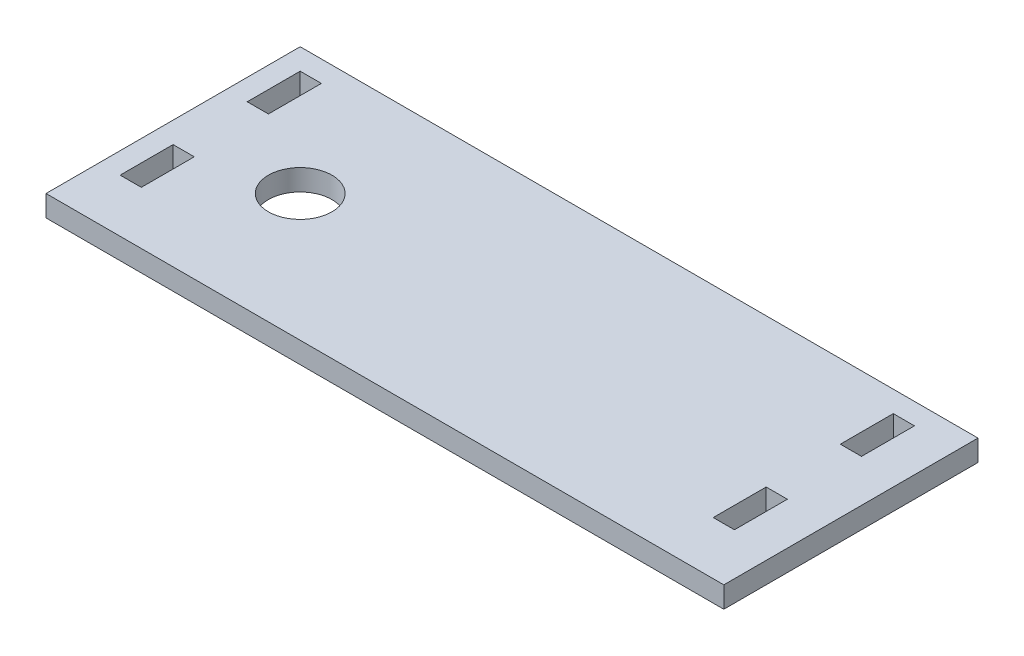
ISO-10303-21;
HEADER;
FILE_DESCRIPTION(('STEP AP214'),'2;1');
FILE_NAME('part.step','',(''),(''),'','','');
FILE_SCHEMA(('AUTOMOTIVE_DESIGN { 1 0 10303 214 1 1 1 1 }'));
ENDSEC;
DATA;
#1=APPLICATION_CONTEXT('core data for automotive mechanical design processes');
#2=APPLICATION_PROTOCOL_DEFINITION('international standard','automotive_design',2000,#1);
#3=PRODUCT_CONTEXT('',#1,'mechanical');
#4=PRODUCT('Part','Part','',(#3));
#5=PRODUCT_RELATED_PRODUCT_CATEGORY('part','',(#4));
#6=PRODUCT_DEFINITION_FORMATION('','',#4);
#7=PRODUCT_DEFINITION_CONTEXT('part definition',#1,'design');
#8=PRODUCT_DEFINITION('design','',#6,#7);
#9=PRODUCT_DEFINITION_SHAPE('','',#8);
#10=(LENGTH_UNIT() NAMED_UNIT(*) SI_UNIT(.MILLI.,.METRE.));
#11=(NAMED_UNIT(*) PLANE_ANGLE_UNIT() SI_UNIT($,.RADIAN.));
#12=(NAMED_UNIT(*) SI_UNIT($,.STERADIAN.) SOLID_ANGLE_UNIT());
#13=UNCERTAINTY_MEASURE_WITH_UNIT(LENGTH_MEASURE(1.E-05),#10,'distance_accuracy_value','');
#14=(GEOMETRIC_REPRESENTATION_CONTEXT(3) GLOBAL_UNCERTAINTY_ASSIGNED_CONTEXT((#13)) GLOBAL_UNIT_ASSIGNED_CONTEXT((#10,
#11,#12)) REPRESENTATION_CONTEXT('',''));
#15=CARTESIAN_POINT('',(0.,0.,0.));
#16=DIRECTION('',(0.,0.,1.));
#17=DIRECTION('',(1.,0.,0.));
#18=AXIS2_PLACEMENT_3D('',#15,#16,#17);
#19=CARTESIAN_POINT('',(0.,6.35,0.));
#20=DIRECTION('',(0.,1.,0.));
#21=DIRECTION('',(0.,0.,1.));
#22=AXIS2_PLACEMENT_3D('',#19,#20,#21);
#23=PLANE('',#22);
#24=DIRECTION('',(0.,0.,1.));
#25=VECTOR('',#24,1.);
#26=CARTESIAN_POINT('',(-101.6,6.35,-38.1));
#27=LINE('',#26,#25);
#28=CARTESIAN_POINT('',(-101.6,6.35,-38.1));
#29=VERTEX_POINT('',#28);
#30=CARTESIAN_POINT('',(-101.6,6.35,38.1));
#31=VERTEX_POINT('',#30);
#32=EDGE_CURVE('E370',#29,#31,#27,.T.);
#33=ORIENTED_EDGE('',*,*,#32,.T.);
#34=DIRECTION('',(1.,0.,0.));
#35=VECTOR('',#34,1.);
#36=CARTESIAN_POINT('',(-101.6,6.35,38.1));
#37=LINE('',#36,#35);
#38=CARTESIAN_POINT('',(101.6,6.35,38.1));
#39=VERTEX_POINT('',#38);
#40=EDGE_CURVE('E374',#31,#39,#37,.T.);
#41=ORIENTED_EDGE('',*,*,#40,.T.);
#42=DIRECTION('',(0.,0.,-1.));
#43=VECTOR('',#42,1.);
#44=CARTESIAN_POINT('',(101.6,6.35,-38.1));
#45=LINE('',#44,#43);
#46=CARTESIAN_POINT('',(101.6,6.35,-38.1));
#47=VERTEX_POINT('',#46);
#48=EDGE_CURVE('E378',#39,#47,#45,.T.);
#49=ORIENTED_EDGE('',*,*,#48,.T.);
#50=DIRECTION('',(-1.,0.,0.));
#51=VECTOR('',#50,1.);
#52=CARTESIAN_POINT('',(-101.6,6.35,-38.1));
#53=LINE('',#52,#51);
#54=EDGE_CURVE('E381',#47,#29,#53,.T.);
#55=ORIENTED_EDGE('',*,*,#54,.T.);
#56=EDGE_LOOP('',(#33,#41,#49,#55));
#57=FACE_BOUND('',#56,.T.);
#58=CARTESIAN_POINT('',(-63.5,6.35,0.));
#59=DIRECTION('',(0.,1.,0.));
#60=DIRECTION('',(0.,0.,1.));
#61=AXIS2_PLACEMENT_3D('',#58,#59,#60);
#62=CIRCLE('',#61,9.525);
#63=CARTESIAN_POINT('',(-63.5,6.35,9.525));
#64=VERTEX_POINT('',#63);
#65=EDGE_CURVE('E362',#64,#64,#62,.T.);
#66=ORIENTED_EDGE('',*,*,#65,.F.);
#67=EDGE_LOOP('',(#66));
#68=FACE_BOUND('',#67,.T.);
#69=DIRECTION('',(1.,0.,0.));
#70=VECTOR('',#69,1.);
#71=CARTESIAN_POINT('',(-95.25,6.35,-15.875));
#72=LINE('',#71,#70);
#73=CARTESIAN_POINT('',(-95.25,6.35,-15.875));
#74=VERTEX_POINT('',#73);
#75=CARTESIAN_POINT('',(-88.9,6.35,-15.875));
#76=VERTEX_POINT('',#75);
#77=EDGE_CURVE('E322',#74,#76,#72,.T.);
#78=ORIENTED_EDGE('',*,*,#77,.F.);
#79=DIRECTION('',(0.,0.,1.));
#80=VECTOR('',#79,1.);
#81=CARTESIAN_POINT('',(-95.25,6.35,-31.75));
#82=LINE('',#81,#80);
#83=CARTESIAN_POINT('',(-95.25,6.35,-31.75));
#84=VERTEX_POINT('',#83);
#85=EDGE_CURVE('E319',#84,#74,#82,.T.);
#86=ORIENTED_EDGE('',*,*,#85,.F.);
#87=DIRECTION('',(-1.,0.,0.));
#88=VECTOR('',#87,1.);
#89=CARTESIAN_POINT('',(-95.25,6.35,-31.75));
#90=LINE('',#89,#88);
#91=CARTESIAN_POINT('',(-88.9,6.35,-31.75));
#92=VERTEX_POINT('',#91);
#93=EDGE_CURVE('E330',#92,#84,#90,.T.);
#94=ORIENTED_EDGE('',*,*,#93,.F.);
#95=DIRECTION('',(0.,0.,-1.));
#96=VECTOR('',#95,1.);
#97=CARTESIAN_POINT('',(-88.9,6.35,-31.75));
#98=LINE('',#97,#96);
#99=EDGE_CURVE('E326',#76,#92,#98,.T.);
#100=ORIENTED_EDGE('',*,*,#99,.F.);
#101=EDGE_LOOP('',(#78,#86,#94,#100));
#102=FACE_BOUND('',#101,.T.);
#103=DIRECTION('',(1.,0.,0.));
#104=VECTOR('',#103,1.);
#105=CARTESIAN_POINT('',(82.55,6.35,22.225));
#106=LINE('',#105,#104);
#107=CARTESIAN_POINT('',(82.55,6.35,22.225));
#108=VERTEX_POINT('',#107);
#109=CARTESIAN_POINT('',(88.9,6.35,22.225));
#110=VERTEX_POINT('',#109);
#111=EDGE_CURVE('E279',#108,#110,#106,.T.);
#112=ORIENTED_EDGE('',*,*,#111,.F.);
#113=DIRECTION('',(0.,0.,1.));
#114=VECTOR('',#113,1.);
#115=CARTESIAN_POINT('',(82.55,6.35,6.35));
#116=LINE('',#115,#114);
#117=CARTESIAN_POINT('',(82.55,6.35,6.35));
#118=VERTEX_POINT('',#117);
#119=EDGE_CURVE('E276',#118,#108,#116,.T.);
#120=ORIENTED_EDGE('',*,*,#119,.F.);
#121=DIRECTION('',(-1.,0.,0.));
#122=VECTOR('',#121,1.);
#123=CARTESIAN_POINT('',(82.55,6.35,6.35));
#124=LINE('',#123,#122);
#125=CARTESIAN_POINT('',(88.9,6.35,6.35));
#126=VERTEX_POINT('',#125);
#127=EDGE_CURVE('E287',#126,#118,#124,.T.);
#128=ORIENTED_EDGE('',*,*,#127,.F.);
#129=DIRECTION('',(0.,0.,-1.));
#130=VECTOR('',#129,1.);
#131=CARTESIAN_POINT('',(88.9,6.35,6.35));
#132=LINE('',#131,#130);
#133=EDGE_CURVE('E283',#110,#126,#132,.T.);
#134=ORIENTED_EDGE('',*,*,#133,.F.);
#135=EDGE_LOOP('',(#112,#120,#128,#134));
#136=FACE_BOUND('',#135,.T.);
#137=DIRECTION('',(1.,0.,0.));
#138=VECTOR('',#137,1.);
#139=CARTESIAN_POINT('',(-95.25,6.35,22.225));
#140=LINE('',#139,#138);
#141=CARTESIAN_POINT('',(-95.25,6.35,22.225));
#142=VERTEX_POINT('',#141);
#143=CARTESIAN_POINT('',(-88.9,6.35,22.225));
#144=VERTEX_POINT('',#143);
#145=EDGE_CURVE('E236',#142,#144,#140,.T.);
#146=ORIENTED_EDGE('',*,*,#145,.F.);
#147=DIRECTION('',(0.,0.,1.));
#148=VECTOR('',#147,1.);
#149=CARTESIAN_POINT('',(-95.25,6.35,6.35));
#150=LINE('',#149,#148);
#151=CARTESIAN_POINT('',(-95.25,6.35,6.35));
#152=VERTEX_POINT('',#151);
#153=EDGE_CURVE('E233',#152,#142,#150,.T.);
#154=ORIENTED_EDGE('',*,*,#153,.F.);
#155=DIRECTION('',(-1.,0.,0.));
#156=VECTOR('',#155,1.);
#157=CARTESIAN_POINT('',(-95.25,6.35,6.35));
#158=LINE('',#157,#156);
#159=CARTESIAN_POINT('',(-88.9,6.35,6.35));
#160=VERTEX_POINT('',#159);
#161=EDGE_CURVE('E244',#160,#152,#158,.T.);
#162=ORIENTED_EDGE('',*,*,#161,.F.);
#163=DIRECTION('',(0.,0.,-1.));
#164=VECTOR('',#163,1.);
#165=CARTESIAN_POINT('',(-88.9,6.35,6.35));
#166=LINE('',#165,#164);
#167=EDGE_CURVE('E240',#144,#160,#166,.T.);
#168=ORIENTED_EDGE('',*,*,#167,.F.);
#169=EDGE_LOOP('',(#146,#154,#162,#168));
#170=FACE_BOUND('',#169,.T.);
#171=DIRECTION('',(1.,0.,0.));
#172=VECTOR('',#171,1.);
#173=CARTESIAN_POINT('',(82.55,6.35,-15.875));
#174=LINE('',#173,#172);
#175=CARTESIAN_POINT('',(82.55,6.35,-15.875));
#176=VERTEX_POINT('',#175);
#177=CARTESIAN_POINT('',(88.9,6.35,-15.875));
#178=VERTEX_POINT('',#177);
#179=EDGE_CURVE('E194',#176,#178,#174,.T.);
#180=ORIENTED_EDGE('',*,*,#179,.F.);
#181=DIRECTION('',(0.,0.,1.));
#182=VECTOR('',#181,1.);
#183=CARTESIAN_POINT('',(82.55,6.35,-31.75));
#184=LINE('',#183,#182);
#185=CARTESIAN_POINT('',(82.55,6.35,-31.75));
#186=VERTEX_POINT('',#185);
#187=EDGE_CURVE('E185',#186,#176,#184,.T.);
#188=ORIENTED_EDGE('',*,*,#187,.F.);
#189=DIRECTION('',(-1.,0.,0.));
#190=VECTOR('',#189,1.);
#191=CARTESIAN_POINT('',(82.55,6.35,-31.75));
#192=LINE('',#191,#190);
#193=CARTESIAN_POINT('',(88.9,6.35,-31.75));
#194=VERTEX_POINT('',#193);
#195=EDGE_CURVE('E211',#194,#186,#192,.T.);
#196=ORIENTED_EDGE('',*,*,#195,.F.);
#197=DIRECTION('',(0.,0.,-1.));
#198=VECTOR('',#197,1.);
#199=CARTESIAN_POINT('',(88.9,6.35,-31.75));
#200=LINE('',#199,#198);
#201=EDGE_CURVE('E207',#178,#194,#200,.T.);
#202=ORIENTED_EDGE('',*,*,#201,.F.);
#203=EDGE_LOOP('',(#180,#188,#196,#202));
#204=FACE_BOUND('',#203,.T.);
#205=ADVANCED_FACE('F47',(#57,#68,#102,#136,#170,#204),#23,.T.);
#206=CARTESIAN_POINT('',(0.,0.,0.));
#207=DIRECTION('',(0.,1.,0.));
#208=DIRECTION('',(0.,0.,1.));
#209=AXIS2_PLACEMENT_3D('',#206,#207,#208);
#210=PLANE('',#209);
#211=DIRECTION('',(0.,0.,1.));
#212=VECTOR('',#211,1.);
#213=CARTESIAN_POINT('',(-95.25,0.,6.35));
#214=LINE('',#213,#212);
#215=CARTESIAN_POINT('',(-95.25,0.,6.35));
#216=VERTEX_POINT('',#215);
#217=CARTESIAN_POINT('',(-95.25,0.,22.225));
#218=VERTEX_POINT('',#217);
#219=EDGE_CURVE('E203',#216,#218,#214,.T.);
#220=ORIENTED_EDGE('',*,*,#219,.T.);
#221=DIRECTION('',(1.,0.,0.));
#222=VECTOR('',#221,1.);
#223=CARTESIAN_POINT('',(-95.25,0.,22.225));
#224=LINE('',#223,#222);
#225=CARTESIAN_POINT('',(-88.9,0.,22.225));
#226=VERTEX_POINT('',#225);
#227=EDGE_CURVE('E251',#218,#226,#224,.T.);
#228=ORIENTED_EDGE('',*,*,#227,.T.);
#229=DIRECTION('',(0.,0.,-1.));
#230=VECTOR('',#229,1.);
#231=CARTESIAN_POINT('',(-88.9,0.,6.35));
#232=LINE('',#231,#230);
#233=CARTESIAN_POINT('',(-88.9,0.,6.35));
#234=VERTEX_POINT('',#233);
#235=EDGE_CURVE('E255',#226,#234,#232,.T.);
#236=ORIENTED_EDGE('',*,*,#235,.T.);
#237=DIRECTION('',(-1.,0.,0.));
#238=VECTOR('',#237,1.);
#239=CARTESIAN_POINT('',(-95.25,0.,6.35));
#240=LINE('',#239,#238);
#241=EDGE_CURVE('E237',#234,#216,#240,.T.);
#242=ORIENTED_EDGE('',*,*,#241,.T.);
#243=EDGE_LOOP('',(#220,#228,#236,#242));
#244=FACE_BOUND('',#243,.T.);
#245=DIRECTION('',(0.,0.,1.));
#246=VECTOR('',#245,1.);
#247=CARTESIAN_POINT('',(-95.25,0.,-31.75));
#248=LINE('',#247,#246);
#249=CARTESIAN_POINT('',(-95.25,0.,-31.75));
#250=VERTEX_POINT('',#249);
#251=CARTESIAN_POINT('',(-95.25,0.,-15.875));
#252=VERTEX_POINT('',#251);
#253=EDGE_CURVE('E318',#250,#252,#248,.T.);
#254=ORIENTED_EDGE('',*,*,#253,.T.);
#255=DIRECTION('',(1.,0.,0.));
#256=VECTOR('',#255,1.);
#257=CARTESIAN_POINT('',(-95.25,0.,-15.875));
#258=LINE('',#257,#256);
#259=CARTESIAN_POINT('',(-88.9,0.,-15.875));
#260=VERTEX_POINT('',#259);
#261=EDGE_CURVE('E337',#252,#260,#258,.T.);
#262=ORIENTED_EDGE('',*,*,#261,.T.);
#263=DIRECTION('',(0.,0.,-1.));
#264=VECTOR('',#263,1.);
#265=CARTESIAN_POINT('',(-88.9,0.,-31.75));
#266=LINE('',#265,#264);
#267=CARTESIAN_POINT('',(-88.9,0.,-31.75));
#268=VERTEX_POINT('',#267);
#269=EDGE_CURVE('E341',#260,#268,#266,.T.);
#270=ORIENTED_EDGE('',*,*,#269,.T.);
#271=DIRECTION('',(-1.,0.,0.));
#272=VECTOR('',#271,1.);
#273=CARTESIAN_POINT('',(-95.25,0.,-31.75));
#274=LINE('',#273,#272);
#275=EDGE_CURVE('E323',#268,#250,#274,.T.);
#276=ORIENTED_EDGE('',*,*,#275,.T.);
#277=EDGE_LOOP('',(#254,#262,#270,#276));
#278=FACE_BOUND('',#277,.T.);
#279=DIRECTION('',(0.,0.,1.));
#280=VECTOR('',#279,1.);
#281=CARTESIAN_POINT('',(-101.6,0.,-38.1));
#282=LINE('',#281,#280);
#283=CARTESIAN_POINT('',(-101.6,0.,-38.1));
#284=VERTEX_POINT('',#283);
#285=CARTESIAN_POINT('',(-101.6,0.,38.1));
#286=VERTEX_POINT('',#285);
#287=EDGE_CURVE('E366',#284,#286,#282,.T.);
#288=ORIENTED_EDGE('',*,*,#287,.F.);
#289=DIRECTION('',(-1.,0.,0.));
#290=VECTOR('',#289,1.);
#291=CARTESIAN_POINT('',(-101.6,0.,-38.1));
#292=LINE('',#291,#290);
#293=CARTESIAN_POINT('',(101.6,0.,-38.1));
#294=VERTEX_POINT('',#293);
#295=EDGE_CURVE('E375',#294,#284,#292,.T.);
#296=ORIENTED_EDGE('',*,*,#295,.F.);
#297=DIRECTION('',(0.,0.,-1.));
#298=VECTOR('',#297,1.);
#299=CARTESIAN_POINT('',(101.6,0.,-38.1));
#300=LINE('',#299,#298);
#301=CARTESIAN_POINT('',(101.6,0.,38.1));
#302=VERTEX_POINT('',#301);
#303=EDGE_CURVE('E391',#302,#294,#300,.T.);
#304=ORIENTED_EDGE('',*,*,#303,.F.);
#305=DIRECTION('',(1.,0.,0.));
#306=VECTOR('',#305,1.);
#307=CARTESIAN_POINT('',(-101.6,0.,38.1));
#308=LINE('',#307,#306);
#309=EDGE_CURVE('E388',#286,#302,#308,.T.);
#310=ORIENTED_EDGE('',*,*,#309,.F.);
#311=EDGE_LOOP('',(#288,#296,#304,#310));
#312=FACE_BOUND('',#311,.T.);
#313=CARTESIAN_POINT('',(-63.5,0.,0.));
#314=DIRECTION('',(0.,1.,0.));
#315=DIRECTION('',(0.,0.,1.));
#316=AXIS2_PLACEMENT_3D('',#313,#314,#315);
#317=CIRCLE('',#316,9.525);
#318=CARTESIAN_POINT('',(-63.5,0.,9.525));
#319=VERTEX_POINT('',#318);
#320=EDGE_CURVE('E361',#319,#319,#317,.T.);
#321=ORIENTED_EDGE('',*,*,#320,.T.);
#322=EDGE_LOOP('',(#321));
#323=FACE_BOUND('',#322,.T.);
#324=DIRECTION('',(0.,0.,1.));
#325=VECTOR('',#324,1.);
#326=CARTESIAN_POINT('',(82.55,0.,6.35));
#327=LINE('',#326,#325);
#328=CARTESIAN_POINT('',(82.55,0.,6.35));
#329=VERTEX_POINT('',#328);
#330=CARTESIAN_POINT('',(82.55,0.,22.225));
#331=VERTEX_POINT('',#330);
#332=EDGE_CURVE('E275',#329,#331,#327,.T.);
#333=ORIENTED_EDGE('',*,*,#332,.T.);
#334=DIRECTION('',(1.,0.,0.));
#335=VECTOR('',#334,1.);
#336=CARTESIAN_POINT('',(82.55,0.,22.225));
#337=LINE('',#336,#335);
#338=CARTESIAN_POINT('',(88.9,0.,22.225));
#339=VERTEX_POINT('',#338);
#340=EDGE_CURVE('E294',#331,#339,#337,.T.);
#341=ORIENTED_EDGE('',*,*,#340,.T.);
#342=DIRECTION('',(0.,0.,-1.));
#343=VECTOR('',#342,1.);
#344=CARTESIAN_POINT('',(88.9,0.,6.35));
#345=LINE('',#344,#343);
#346=CARTESIAN_POINT('',(88.9,0.,6.35));
#347=VERTEX_POINT('',#346);
#348=EDGE_CURVE('E298',#339,#347,#345,.T.);
#349=ORIENTED_EDGE('',*,*,#348,.T.);
#350=DIRECTION('',(-1.,0.,0.));
#351=VECTOR('',#350,1.);
#352=CARTESIAN_POINT('',(82.55,0.,6.35));
#353=LINE('',#352,#351);
#354=EDGE_CURVE('E280',#347,#329,#353,.T.);
#355=ORIENTED_EDGE('',*,*,#354,.T.);
#356=EDGE_LOOP('',(#333,#341,#349,#355));
#357=FACE_BOUND('',#356,.T.);
#358=DIRECTION('',(0.,0.,1.));
#359=VECTOR('',#358,1.);
#360=CARTESIAN_POINT('',(82.55,0.,-31.75));
#361=LINE('',#360,#359);
#362=CARTESIAN_POINT('',(82.55,0.,-31.75));
#363=VERTEX_POINT('',#362);
#364=CARTESIAN_POINT('',(82.55,0.,-15.875));
#365=VERTEX_POINT('',#364);
#366=EDGE_CURVE('E71',#363,#365,#361,.T.);
#367=ORIENTED_EDGE('',*,*,#366,.T.);
#368=DIRECTION('',(1.,0.,0.));
#369=VECTOR('',#368,1.);
#370=CARTESIAN_POINT('',(82.55,0.,-15.875));
#371=LINE('',#370,#369);
#372=CARTESIAN_POINT('',(88.9,0.,-15.875));
#373=VERTEX_POINT('',#372);
#374=EDGE_CURVE('E201',#365,#373,#371,.T.);
#375=ORIENTED_EDGE('',*,*,#374,.T.);
#376=DIRECTION('',(0.,0.,-1.));
#377=VECTOR('',#376,1.);
#378=CARTESIAN_POINT('',(88.9,0.,-31.75));
#379=LINE('',#378,#377);
#380=CARTESIAN_POINT('',(88.9,0.,-31.75));
#381=VERTEX_POINT('',#380);
#382=EDGE_CURVE('E220',#373,#381,#379,.T.);
#383=ORIENTED_EDGE('',*,*,#382,.T.);
#384=DIRECTION('',(-1.,0.,0.));
#385=VECTOR('',#384,1.);
#386=CARTESIAN_POINT('',(82.55,0.,-31.75));
#387=LINE('',#386,#385);
#388=EDGE_CURVE('E195',#381,#363,#387,.T.);
#389=ORIENTED_EDGE('',*,*,#388,.T.);
#390=EDGE_LOOP('',(#367,#375,#383,#389));
#391=FACE_BOUND('',#390,.T.);
#392=ADVANCED_FACE('F414',(#244,#278,#312,#323,#357,#391),#210,.F.);
#393=CARTESIAN_POINT('',(-101.6,6.35,-38.1));
#394=DIRECTION('',(1.,0.,0.));
#395=DIRECTION('',(0.,0.,-1.));
#396=AXIS2_PLACEMENT_3D('',#393,#394,#395);
#397=PLANE('',#396);
#398=ORIENTED_EDGE('',*,*,#287,.T.);
#399=DIRECTION('',(0.,-1.,0.));
#400=VECTOR('',#399,1.);
#401=CARTESIAN_POINT('',(-101.6,6.35,38.1));
#402=LINE('',#401,#400);
#403=EDGE_CURVE('E11',#31,#286,#402,.T.);
#404=ORIENTED_EDGE('',*,*,#403,.F.);
#405=ORIENTED_EDGE('',*,*,#32,.F.);
#406=DIRECTION('',(0.,-1.,0.));
#407=VECTOR('',#406,1.);
#408=CARTESIAN_POINT('',(-101.6,6.35,-38.1));
#409=LINE('',#408,#407);
#410=EDGE_CURVE('E384',#29,#284,#409,.T.);
#411=ORIENTED_EDGE('',*,*,#410,.T.);
#412=EDGE_LOOP('',(#398,#404,#405,#411));
#413=FACE_BOUND('',#412,.T.);
#414=ADVANCED_FACE('F49',(#413),#397,.F.);
#415=CARTESIAN_POINT('',(-101.6,6.35,38.1));
#416=DIRECTION('',(0.,0.,-1.));
#417=DIRECTION('',(-1.,0.,0.));
#418=AXIS2_PLACEMENT_3D('',#415,#416,#417);
#419=PLANE('',#418);
#420=ORIENTED_EDGE('',*,*,#309,.T.);
#421=DIRECTION('',(0.,-1.,0.));
#422=VECTOR('',#421,1.);
#423=CARTESIAN_POINT('',(101.6,6.35,38.1));
#424=LINE('',#423,#422);
#425=EDGE_CURVE('E56',#39,#302,#424,.T.);
#426=ORIENTED_EDGE('',*,*,#425,.F.);
#427=ORIENTED_EDGE('',*,*,#40,.F.);
#428=ORIENTED_EDGE('',*,*,#403,.T.);
#429=EDGE_LOOP('',(#420,#426,#427,#428));
#430=FACE_BOUND('',#429,.T.);
#431=ADVANCED_FACE('F425',(#430),#419,.F.);
#432=CARTESIAN_POINT('',(101.6,6.35,-38.1));
#433=DIRECTION('',(-1.,0.,0.));
#434=DIRECTION('',(0.,0.,1.));
#435=AXIS2_PLACEMENT_3D('',#432,#433,#434);
#436=PLANE('',#435);
#437=ORIENTED_EDGE('',*,*,#303,.T.);
#438=DIRECTION('',(0.,-1.,0.));
#439=VECTOR('',#438,1.);
#440=CARTESIAN_POINT('',(101.6,6.35,-38.1));
#441=LINE('',#440,#439);
#442=EDGE_CURVE('E399',#47,#294,#441,.T.);
#443=ORIENTED_EDGE('',*,*,#442,.F.);
#444=ORIENTED_EDGE('',*,*,#48,.F.);
#445=ORIENTED_EDGE('',*,*,#425,.T.);
#446=EDGE_LOOP('',(#437,#443,#444,#445));
#447=FACE_BOUND('',#446,.T.);
#448=ADVANCED_FACE('F408',(#447),#436,.F.);
#449=CARTESIAN_POINT('',(-101.6,6.35,-38.1));
#450=DIRECTION('',(0.,0.,1.));
#451=DIRECTION('',(1.,0.,0.));
#452=AXIS2_PLACEMENT_3D('',#449,#450,#451);
#453=PLANE('',#452);
#454=ORIENTED_EDGE('',*,*,#295,.T.);
#455=ORIENTED_EDGE('',*,*,#410,.F.);
#456=ORIENTED_EDGE('',*,*,#54,.F.);
#457=ORIENTED_EDGE('',*,*,#442,.T.);
#458=EDGE_LOOP('',(#454,#455,#456,#457));
#459=FACE_BOUND('',#458,.T.);
#460=ADVANCED_FACE('F418',(#459),#453,.F.);
#461=CARTESIAN_POINT('',(-63.5,6.35,0.));
#462=DIRECTION('',(0.,-1.,0.));
#463=DIRECTION('',(0.,0.,-1.));
#464=AXIS2_PLACEMENT_3D('',#461,#462,#463);
#465=CYLINDRICAL_SURFACE('',#464,9.525);
#466=ORIENTED_EDGE('',*,*,#65,.T.);
#467=EDGE_LOOP('',(#466));
#468=FACE_BOUND('',#467,.T.);
#469=ORIENTED_EDGE('',*,*,#320,.F.);
#470=EDGE_LOOP('',(#469));
#471=FACE_BOUND('',#470,.T.);
#472=ADVANCED_FACE('F440',(#468,#471),#465,.F.);
#473=CARTESIAN_POINT('',(-95.25,6.35,-31.75));
#474=DIRECTION('',(1.,0.,0.));
#475=DIRECTION('',(0.,0.,-1.));
#476=AXIS2_PLACEMENT_3D('',#473,#474,#475);
#477=PLANE('',#476);
#478=ORIENTED_EDGE('',*,*,#253,.F.);
#479=DIRECTION('',(0.,-1.,0.));
#480=VECTOR('',#479,1.);
#481=CARTESIAN_POINT('',(-95.25,6.35,-31.75));
#482=LINE('',#481,#480);
#483=EDGE_CURVE('E333',#84,#250,#482,.T.);
#484=ORIENTED_EDGE('',*,*,#483,.F.);
#485=ORIENTED_EDGE('',*,*,#85,.T.);
#486=DIRECTION('',(0.,-1.,0.));
#487=VECTOR('',#486,1.);
#488=CARTESIAN_POINT('',(-95.25,6.35,-15.875));
#489=LINE('',#488,#487);
#490=EDGE_CURVE('E357',#74,#252,#489,.T.);
#491=ORIENTED_EDGE('',*,*,#490,.T.);
#492=EDGE_LOOP('',(#478,#484,#485,#491));
#493=FACE_BOUND('',#492,.T.);
#494=ADVANCED_FACE('F447',(#493),#477,.T.);
#495=CARTESIAN_POINT('',(-95.25,6.35,-15.875));
#496=DIRECTION('',(0.,0.,-1.));
#497=DIRECTION('',(-1.,0.,0.));
#498=AXIS2_PLACEMENT_3D('',#495,#496,#497);
#499=PLANE('',#498);
#500=ORIENTED_EDGE('',*,*,#261,.F.);
#501=ORIENTED_EDGE('',*,*,#490,.F.);
#502=ORIENTED_EDGE('',*,*,#77,.T.);
#503=DIRECTION('',(0.,-1.,0.));
#504=VECTOR('',#503,1.);
#505=CARTESIAN_POINT('',(-88.9,6.35,-15.875));
#506=LINE('',#505,#504);
#507=EDGE_CURVE('E354',#76,#260,#506,.T.);
#508=ORIENTED_EDGE('',*,*,#507,.T.);
#509=EDGE_LOOP('',(#500,#501,#502,#508));
#510=FACE_BOUND('',#509,.T.);
#511=ADVANCED_FACE('F452',(#510),#499,.T.);
#512=CARTESIAN_POINT('',(-88.9,6.35,-31.75));
#513=DIRECTION('',(-1.,0.,0.));
#514=DIRECTION('',(0.,0.,1.));
#515=AXIS2_PLACEMENT_3D('',#512,#513,#514);
#516=PLANE('',#515);
#517=ORIENTED_EDGE('',*,*,#269,.F.);
#518=ORIENTED_EDGE('',*,*,#507,.F.);
#519=ORIENTED_EDGE('',*,*,#99,.T.);
#520=DIRECTION('',(0.,-1.,0.));
#521=VECTOR('',#520,1.);
#522=CARTESIAN_POINT('',(-88.9,6.35,-31.75));
#523=LINE('',#522,#521);
#524=EDGE_CURVE('E351',#92,#268,#523,.T.);
#525=ORIENTED_EDGE('',*,*,#524,.T.);
#526=EDGE_LOOP('',(#517,#518,#519,#525));
#527=FACE_BOUND('',#526,.T.);
#528=ADVANCED_FACE('F509',(#527),#516,.T.);
#529=CARTESIAN_POINT('',(-95.25,6.35,-31.75));
#530=DIRECTION('',(0.,0.,1.));
#531=DIRECTION('',(1.,0.,0.));
#532=AXIS2_PLACEMENT_3D('',#529,#530,#531);
#533=PLANE('',#532);
#534=ORIENTED_EDGE('',*,*,#275,.F.);
#535=ORIENTED_EDGE('',*,*,#524,.F.);
#536=ORIENTED_EDGE('',*,*,#93,.T.);
#537=ORIENTED_EDGE('',*,*,#483,.T.);
#538=EDGE_LOOP('',(#534,#535,#536,#537));
#539=FACE_BOUND('',#538,.T.);
#540=ADVANCED_FACE('F505',(#539),#533,.T.);
#541=CARTESIAN_POINT('',(82.55,6.35,6.35));
#542=DIRECTION('',(1.,0.,0.));
#543=DIRECTION('',(0.,0.,-1.));
#544=AXIS2_PLACEMENT_3D('',#541,#542,#543);
#545=PLANE('',#544);
#546=ORIENTED_EDGE('',*,*,#332,.F.);
#547=DIRECTION('',(0.,-1.,0.));
#548=VECTOR('',#547,1.);
#549=CARTESIAN_POINT('',(82.55,6.35,6.35));
#550=LINE('',#549,#548);
#551=EDGE_CURVE('E290',#118,#329,#550,.T.);
#552=ORIENTED_EDGE('',*,*,#551,.F.);
#553=ORIENTED_EDGE('',*,*,#119,.T.);
#554=DIRECTION('',(0.,-1.,0.));
#555=VECTOR('',#554,1.);
#556=CARTESIAN_POINT('',(82.55,6.35,22.225));
#557=LINE('',#556,#555);
#558=EDGE_CURVE('E314',#108,#331,#557,.T.);
#559=ORIENTED_EDGE('',*,*,#558,.T.);
#560=EDGE_LOOP('',(#546,#552,#553,#559));
#561=FACE_BOUND('',#560,.T.);
#562=ADVANCED_FACE('F501',(#561),#545,.T.);
#563=CARTESIAN_POINT('',(82.55,6.35,22.225));
#564=DIRECTION('',(0.,0.,-1.));
#565=DIRECTION('',(-1.,0.,0.));
#566=AXIS2_PLACEMENT_3D('',#563,#564,#565);
#567=PLANE('',#566);
#568=ORIENTED_EDGE('',*,*,#340,.F.);
#569=ORIENTED_EDGE('',*,*,#558,.F.);
#570=ORIENTED_EDGE('',*,*,#111,.T.);
#571=DIRECTION('',(0.,-1.,0.));
#572=VECTOR('',#571,1.);
#573=CARTESIAN_POINT('',(88.9,6.35,22.225));
#574=LINE('',#573,#572);
#575=EDGE_CURVE('E311',#110,#339,#574,.T.);
#576=ORIENTED_EDGE('',*,*,#575,.T.);
#577=EDGE_LOOP('',(#568,#569,#570,#576));
#578=FACE_BOUND('',#577,.T.);
#579=ADVANCED_FACE('F497',(#578),#567,.T.);
#580=CARTESIAN_POINT('',(88.9,6.35,6.35));
#581=DIRECTION('',(-1.,0.,0.));
#582=DIRECTION('',(0.,0.,1.));
#583=AXIS2_PLACEMENT_3D('',#580,#581,#582);
#584=PLANE('',#583);
#585=ORIENTED_EDGE('',*,*,#348,.F.);
#586=ORIENTED_EDGE('',*,*,#575,.F.);
#587=ORIENTED_EDGE('',*,*,#133,.T.);
#588=DIRECTION('',(0.,-1.,0.));
#589=VECTOR('',#588,1.);
#590=CARTESIAN_POINT('',(88.9,6.35,6.35));
#591=LINE('',#590,#589);
#592=EDGE_CURVE('E308',#126,#347,#591,.T.);
#593=ORIENTED_EDGE('',*,*,#592,.T.);
#594=EDGE_LOOP('',(#585,#586,#587,#593));
#595=FACE_BOUND('',#594,.T.);
#596=ADVANCED_FACE('F493',(#595),#584,.T.);
#597=CARTESIAN_POINT('',(82.55,6.35,6.35));
#598=DIRECTION('',(0.,0.,1.));
#599=DIRECTION('',(1.,0.,0.));
#600=AXIS2_PLACEMENT_3D('',#597,#598,#599);
#601=PLANE('',#600);
#602=ORIENTED_EDGE('',*,*,#354,.F.);
#603=ORIENTED_EDGE('',*,*,#592,.F.);
#604=ORIENTED_EDGE('',*,*,#127,.T.);
#605=ORIENTED_EDGE('',*,*,#551,.T.);
#606=EDGE_LOOP('',(#602,#603,#604,#605));
#607=FACE_BOUND('',#606,.T.);
#608=ADVANCED_FACE('F489',(#607),#601,.T.);
#609=CARTESIAN_POINT('',(-95.25,6.35,6.35));
#610=DIRECTION('',(1.,0.,0.));
#611=DIRECTION('',(0.,0.,-1.));
#612=AXIS2_PLACEMENT_3D('',#609,#610,#611);
#613=PLANE('',#612);
#614=ORIENTED_EDGE('',*,*,#219,.F.);
#615=DIRECTION('',(0.,-1.,0.));
#616=VECTOR('',#615,1.);
#617=CARTESIAN_POINT('',(-95.25,6.35,6.35));
#618=LINE('',#617,#616);
#619=EDGE_CURVE('E247',#152,#216,#618,.T.);
#620=ORIENTED_EDGE('',*,*,#619,.F.);
#621=ORIENTED_EDGE('',*,*,#153,.T.);
#622=DIRECTION('',(0.,-1.,0.));
#623=VECTOR('',#622,1.);
#624=CARTESIAN_POINT('',(-95.25,6.35,22.225));
#625=LINE('',#624,#623);
#626=EDGE_CURVE('E271',#142,#218,#625,.T.);
#627=ORIENTED_EDGE('',*,*,#626,.T.);
#628=EDGE_LOOP('',(#614,#620,#621,#627));
#629=FACE_BOUND('',#628,.T.);
#630=ADVANCED_FACE('F485',(#629),#613,.T.);
#631=CARTESIAN_POINT('',(-95.25,6.35,22.225));
#632=DIRECTION('',(0.,0.,-1.));
#633=DIRECTION('',(-1.,0.,0.));
#634=AXIS2_PLACEMENT_3D('',#631,#632,#633);
#635=PLANE('',#634);
#636=ORIENTED_EDGE('',*,*,#227,.F.);
#637=ORIENTED_EDGE('',*,*,#626,.F.);
#638=ORIENTED_EDGE('',*,*,#145,.T.);
#639=DIRECTION('',(0.,-1.,0.));
#640=VECTOR('',#639,1.);
#641=CARTESIAN_POINT('',(-88.9,6.35,22.225));
#642=LINE('',#641,#640);
#643=EDGE_CURVE('E268',#144,#226,#642,.T.);
#644=ORIENTED_EDGE('',*,*,#643,.T.);
#645=EDGE_LOOP('',(#636,#637,#638,#644));
#646=FACE_BOUND('',#645,.T.);
#647=ADVANCED_FACE('F481',(#646),#635,.T.);
#648=CARTESIAN_POINT('',(-88.9,6.35,6.35));
#649=DIRECTION('',(-1.,0.,0.));
#650=DIRECTION('',(0.,0.,1.));
#651=AXIS2_PLACEMENT_3D('',#648,#649,#650);
#652=PLANE('',#651);
#653=ORIENTED_EDGE('',*,*,#235,.F.);
#654=ORIENTED_EDGE('',*,*,#643,.F.);
#655=ORIENTED_EDGE('',*,*,#167,.T.);
#656=DIRECTION('',(0.,-1.,0.));
#657=VECTOR('',#656,1.);
#658=CARTESIAN_POINT('',(-88.9,6.35,6.35));
#659=LINE('',#658,#657);
#660=EDGE_CURVE('E265',#160,#234,#659,.T.);
#661=ORIENTED_EDGE('',*,*,#660,.T.);
#662=EDGE_LOOP('',(#653,#654,#655,#661));
#663=FACE_BOUND('',#662,.T.);
#664=ADVANCED_FACE('F477',(#663),#652,.T.);
#665=CARTESIAN_POINT('',(-95.25,6.35,6.35));
#666=DIRECTION('',(0.,0.,1.));
#667=DIRECTION('',(1.,0.,0.));
#668=AXIS2_PLACEMENT_3D('',#665,#666,#667);
#669=PLANE('',#668);
#670=ORIENTED_EDGE('',*,*,#241,.F.);
#671=ORIENTED_EDGE('',*,*,#660,.F.);
#672=ORIENTED_EDGE('',*,*,#161,.T.);
#673=ORIENTED_EDGE('',*,*,#619,.T.);
#674=EDGE_LOOP('',(#670,#671,#672,#673));
#675=FACE_BOUND('',#674,.T.);
#676=ADVANCED_FACE('F474',(#675),#669,.T.);
#677=CARTESIAN_POINT('',(82.55,6.35,-31.75));
#678=DIRECTION('',(1.,0.,0.));
#679=DIRECTION('',(0.,0.,-1.));
#680=AXIS2_PLACEMENT_3D('',#677,#678,#679);
#681=PLANE('',#680);
#682=ORIENTED_EDGE('',*,*,#366,.F.);
#683=DIRECTION('',(0.,-1.,0.));
#684=VECTOR('',#683,1.);
#685=CARTESIAN_POINT('',(82.55,6.35,-31.75));
#686=LINE('',#685,#684);
#687=EDGE_CURVE('E189',#186,#363,#686,.T.);
#688=ORIENTED_EDGE('',*,*,#687,.F.);
#689=ORIENTED_EDGE('',*,*,#187,.T.);
#690=DIRECTION('',(0.,-1.,0.));
#691=VECTOR('',#690,1.);
#692=CARTESIAN_POINT('',(82.55,6.35,-15.875));
#693=LINE('',#692,#691);
#694=EDGE_CURVE('E188',#176,#365,#693,.T.);
#695=ORIENTED_EDGE('',*,*,#694,.T.);
#696=EDGE_LOOP('',(#682,#688,#689,#695));
#697=FACE_BOUND('',#696,.T.);
#698=ADVANCED_FACE('F187',(#697),#681,.T.);
#699=CARTESIAN_POINT('',(82.55,6.35,-15.875));
#700=DIRECTION('',(0.,0.,-1.));
#701=DIRECTION('',(-1.,0.,0.));
#702=AXIS2_PLACEMENT_3D('',#699,#700,#701);
#703=PLANE('',#702);
#704=ORIENTED_EDGE('',*,*,#374,.F.);
#705=ORIENTED_EDGE('',*,*,#694,.F.);
#706=ORIENTED_EDGE('',*,*,#179,.T.);
#707=DIRECTION('',(0.,-1.,0.));
#708=VECTOR('',#707,1.);
#709=CARTESIAN_POINT('',(88.9,6.35,-15.875));
#710=LINE('',#709,#708);
#711=EDGE_CURVE('E204',#178,#373,#710,.T.);
#712=ORIENTED_EDGE('',*,*,#711,.T.);
#713=EDGE_LOOP('',(#704,#705,#706,#712));
#714=FACE_BOUND('',#713,.T.);
#715=ADVANCED_FACE('F198',(#714),#703,.T.);
#716=CARTESIAN_POINT('',(88.9,6.35,-31.75));
#717=DIRECTION('',(-1.,0.,0.));
#718=DIRECTION('',(0.,0.,1.));
#719=AXIS2_PLACEMENT_3D('',#716,#717,#718);
#720=PLANE('',#719);
#721=ORIENTED_EDGE('',*,*,#382,.F.);
#722=ORIENTED_EDGE('',*,*,#711,.F.);
#723=ORIENTED_EDGE('',*,*,#201,.T.);
#724=DIRECTION('',(0.,-1.,0.));
#725=VECTOR('',#724,1.);
#726=CARTESIAN_POINT('',(88.9,6.35,-31.75));
#727=LINE('',#726,#725);
#728=EDGE_CURVE('E63',#194,#381,#727,.T.);
#729=ORIENTED_EDGE('',*,*,#728,.T.);
#730=EDGE_LOOP('',(#721,#722,#723,#729));
#731=FACE_BOUND('',#730,.T.);
#732=ADVANCED_FACE('F462',(#731),#720,.T.);
#733=CARTESIAN_POINT('',(82.55,6.35,-31.75));
#734=DIRECTION('',(0.,0.,1.));
#735=DIRECTION('',(1.,0.,0.));
#736=AXIS2_PLACEMENT_3D('',#733,#734,#735);
#737=PLANE('',#736);
#738=ORIENTED_EDGE('',*,*,#388,.F.);
#739=ORIENTED_EDGE('',*,*,#728,.F.);
#740=ORIENTED_EDGE('',*,*,#195,.T.);
#741=ORIENTED_EDGE('',*,*,#687,.T.);
#742=EDGE_LOOP('',(#738,#739,#740,#741));
#743=FACE_BOUND('',#742,.T.);
#744=ADVANCED_FACE('F460',(#743),#737,.T.);
#745=CLOSED_SHELL('',(#205,#392,#414,#431,#448,#460,#472,#494,#511,#528,#540,#562,#579,#596,
#608,#630,#647,#664,#676,#698,#715,#732,#744));
#746=MANIFOLD_SOLID_BREP('B2',#745);
#747=ADVANCED_BREP_SHAPE_REPRESENTATION('',(#18,#746),#14);
#748=SHAPE_DEFINITION_REPRESENTATION(#9,#747);
ENDSEC;
END-ISO-10303-21;
